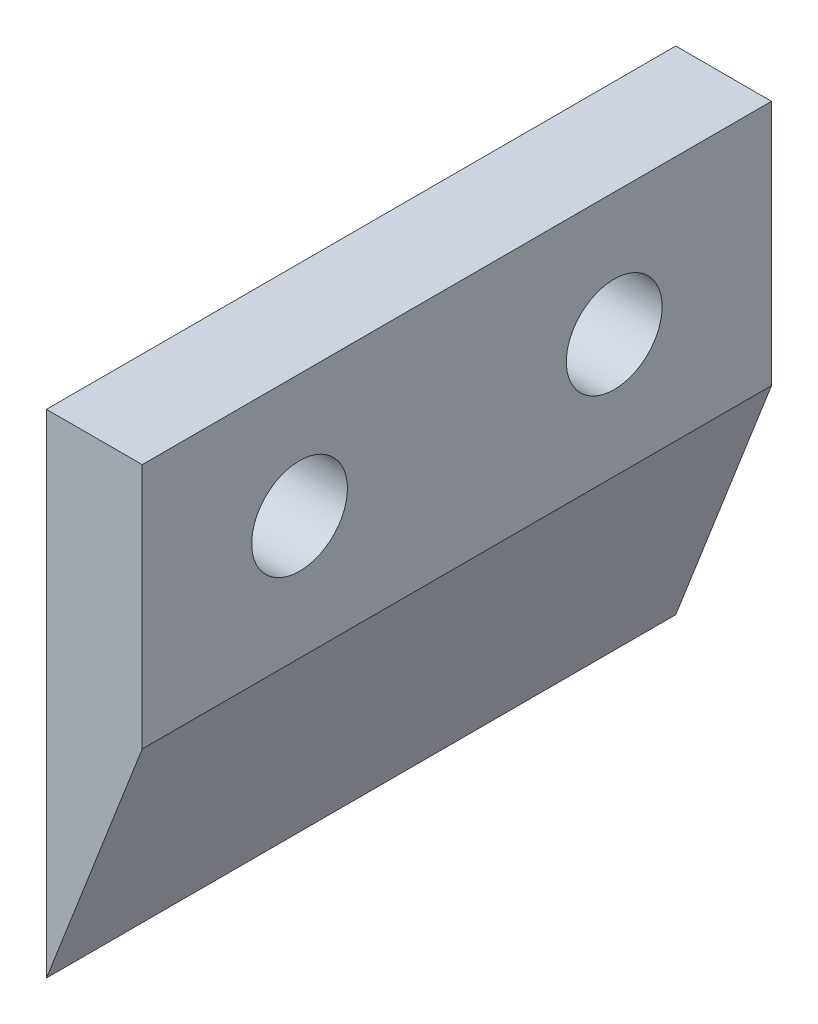
ISO-10303-21;
HEADER;
FILE_DESCRIPTION(('STEP AP214'),'2;1');
FILE_NAME('part.step','',(''),(''),'','','');
FILE_SCHEMA(('AUTOMOTIVE_DESIGN { 1 0 10303 214 1 1 1 1 }'));
ENDSEC;
DATA;
#1=APPLICATION_CONTEXT('core data for automotive mechanical design processes');
#2=APPLICATION_PROTOCOL_DEFINITION('international standard','automotive_design',2000,#1);
#3=PRODUCT_CONTEXT('',#1,'mechanical');
#4=PRODUCT('Part','Part','',(#3));
#5=PRODUCT_RELATED_PRODUCT_CATEGORY('part','',(#4));
#6=PRODUCT_DEFINITION_FORMATION('','',#4);
#7=PRODUCT_DEFINITION_CONTEXT('part definition',#1,'design');
#8=PRODUCT_DEFINITION('design','',#6,#7);
#9=PRODUCT_DEFINITION_SHAPE('','',#8);
#10=(LENGTH_UNIT() NAMED_UNIT(*) SI_UNIT(.MILLI.,.METRE.));
#11=(NAMED_UNIT(*) PLANE_ANGLE_UNIT() SI_UNIT($,.RADIAN.));
#12=(NAMED_UNIT(*) SI_UNIT($,.STERADIAN.) SOLID_ANGLE_UNIT());
#13=UNCERTAINTY_MEASURE_WITH_UNIT(LENGTH_MEASURE(1.E-05),#10,'distance_accuracy_value','');
#14=(GEOMETRIC_REPRESENTATION_CONTEXT(3) GLOBAL_UNCERTAINTY_ASSIGNED_CONTEXT((#13)) GLOBAL_UNIT_ASSIGNED_CONTEXT((#10,
#11,#12)) REPRESENTATION_CONTEXT('',''));
#15=CARTESIAN_POINT('',(0.,0.,0.));
#16=DIRECTION('',(0.,0.,1.));
#17=DIRECTION('',(1.,0.,0.));
#18=AXIS2_PLACEMENT_3D('',#15,#16,#17);
#19=CARTESIAN_POINT('',(3.5,0.,0.));
#20=DIRECTION('',(0.,0.,-1.));
#21=DIRECTION('',(-1.,0.,0.));
#22=AXIS2_PLACEMENT_3D('',#19,#20,#21);
#23=PLANE('',#22);
#24=DIRECTION('',(0.,-1.,0.));
#25=VECTOR('',#24,1.);
#26=CARTESIAN_POINT('',(0.,0.,0.));
#27=LINE('',#26,#25);
#28=CARTESIAN_POINT('',(0.,18.,0.));
#29=VERTEX_POINT('',#28);
#30=CARTESIAN_POINT('',(0.,0.,0.));
#31=VERTEX_POINT('',#30);
#32=EDGE_CURVE('E79',#29,#31,#27,.T.);
#33=ORIENTED_EDGE('',*,*,#32,.T.);
#34=DIRECTION('',(-0.362446261154948,-0.932004671541296,0.));
#35=VECTOR('',#34,1.);
#36=CARTESIAN_POINT('',(3.5,9.,0.));
#37=LINE('',#36,#35);
#38=CARTESIAN_POINT('',(3.5,9.,0.));
#39=VERTEX_POINT('',#38);
#40=EDGE_CURVE('E96',#39,#31,#37,.T.);
#41=ORIENTED_EDGE('',*,*,#40,.F.);
#42=DIRECTION('',(0.,-1.,0.));
#43=VECTOR('',#42,1.);
#44=CARTESIAN_POINT('',(3.5,0.,0.));
#45=LINE('',#44,#43);
#46=CARTESIAN_POINT('',(3.5,18.,0.));
#47=VERTEX_POINT('',#46);
#48=EDGE_CURVE('E74',#47,#39,#45,.T.);
#49=ORIENTED_EDGE('',*,*,#48,.F.);
#50=DIRECTION('',(-1.,0.,0.));
#51=VECTOR('',#50,1.);
#52=CARTESIAN_POINT('',(3.5,18.,0.));
#53=LINE('',#52,#51);
#54=EDGE_CURVE('E42',#47,#29,#53,.T.);
#55=ORIENTED_EDGE('',*,*,#54,.T.);
#56=EDGE_LOOP('',(#33,#41,#49,#55));
#57=FACE_BOUND('',#56,.T.);
#58=ADVANCED_FACE('F34',(#57),#23,.F.);
#59=CARTESIAN_POINT('',(3.5,0.,-23.));
#60=DIRECTION('',(0.,0.,1.));
#61=DIRECTION('',(1.,0.,0.));
#62=AXIS2_PLACEMENT_3D('',#59,#60,#61);
#63=PLANE('',#62);
#64=DIRECTION('',(0.,1.,0.));
#65=VECTOR('',#64,1.);
#66=CARTESIAN_POINT('',(3.5,0.,-23.));
#67=LINE('',#66,#65);
#68=CARTESIAN_POINT('',(3.5,9.,-23.));
#69=VERTEX_POINT('',#68);
#70=CARTESIAN_POINT('',(3.5,18.,-23.));
#71=VERTEX_POINT('',#70);
#72=EDGE_CURVE('E93',#69,#71,#67,.T.);
#73=ORIENTED_EDGE('',*,*,#72,.F.);
#74=DIRECTION('',(-0.362446261154948,-0.932004671541296,0.));
#75=VECTOR('',#74,1.);
#76=CARTESIAN_POINT('',(3.5,9.,-23.));
#77=LINE('',#76,#75);
#78=CARTESIAN_POINT('',(0.,0.,-23.));
#79=VERTEX_POINT('',#78);
#80=EDGE_CURVE('E88',#69,#79,#77,.T.);
#81=ORIENTED_EDGE('',*,*,#80,.T.);
#82=DIRECTION('',(0.,1.,0.));
#83=VECTOR('',#82,1.);
#84=CARTESIAN_POINT('',(0.,0.,-23.));
#85=LINE('',#84,#83);
#86=CARTESIAN_POINT('',(0.,18.,-23.));
#87=VERTEX_POINT('',#86);
#88=EDGE_CURVE('E64',#79,#87,#85,.T.);
#89=ORIENTED_EDGE('',*,*,#88,.T.);
#90=DIRECTION('',(-1.,0.,0.));
#91=VECTOR('',#90,1.);
#92=CARTESIAN_POINT('',(3.5,18.,-23.));
#93=LINE('',#92,#91);
#94=EDGE_CURVE('E11',#71,#87,#93,.T.);
#95=ORIENTED_EDGE('',*,*,#94,.F.);
#96=EDGE_LOOP('',(#73,#81,#89,#95));
#97=FACE_BOUND('',#96,.T.);
#98=ADVANCED_FACE('F135',(#97),#63,.F.);
#99=CARTESIAN_POINT('',(3.5,18.,0.));
#100=DIRECTION('',(0.,-1.,0.));
#101=DIRECTION('',(0.,0.,-1.));
#102=AXIS2_PLACEMENT_3D('',#99,#100,#101);
#103=PLANE('',#102);
#104=DIRECTION('',(0.,0.,1.));
#105=VECTOR('',#104,1.);
#106=CARTESIAN_POINT('',(0.,18.,0.));
#107=LINE('',#106,#105);
#108=EDGE_CURVE('E68',#87,#29,#107,.T.);
#109=ORIENTED_EDGE('',*,*,#108,.T.);
#110=ORIENTED_EDGE('',*,*,#54,.F.);
#111=DIRECTION('',(0.,0.,1.));
#112=VECTOR('',#111,1.);
#113=CARTESIAN_POINT('',(3.5,18.,0.));
#114=LINE('',#113,#112);
#115=EDGE_CURVE('E50',#71,#47,#114,.T.);
#116=ORIENTED_EDGE('',*,*,#115,.F.);
#117=ORIENTED_EDGE('',*,*,#94,.T.);
#118=EDGE_LOOP('',(#109,#110,#116,#117));
#119=FACE_BOUND('',#118,.T.);
#120=ADVANCED_FACE('F70',(#119),#103,.F.);
#121=CARTESIAN_POINT('',(3.5,0.,0.));
#122=DIRECTION('',(-1.,0.,0.));
#123=DIRECTION('',(0.,0.,1.));
#124=AXIS2_PLACEMENT_3D('',#121,#122,#123);
#125=PLANE('',#124);
#126=CARTESIAN_POINT('',(3.5,13.5,-17.25));
#127=DIRECTION('',(1.,0.,0.));
#128=DIRECTION('',(0.,0.,-1.));
#129=AXIS2_PLACEMENT_3D('',#126,#127,#128);
#130=CIRCLE('',#129,1.75);
#131=CARTESIAN_POINT('',(3.5,13.5,-19.));
#132=VERTEX_POINT('',#131);
#133=EDGE_CURVE('E106',#132,#132,#130,.T.);
#134=ORIENTED_EDGE('',*,*,#133,.F.);
#135=EDGE_LOOP('',(#134));
#136=FACE_BOUND('',#135,.T.);
#137=CARTESIAN_POINT('',(3.5,13.5,-5.75));
#138=DIRECTION('',(1.,0.,0.));
#139=DIRECTION('',(0.,0.,-1.));
#140=AXIS2_PLACEMENT_3D('',#137,#138,#139);
#141=CIRCLE('',#140,1.75);
#142=CARTESIAN_POINT('',(3.5,13.5,-7.5));
#143=VERTEX_POINT('',#142);
#144=EDGE_CURVE('E100',#143,#143,#141,.T.);
#145=ORIENTED_EDGE('',*,*,#144,.F.);
#146=EDGE_LOOP('',(#145));
#147=FACE_BOUND('',#146,.T.);
#148=ORIENTED_EDGE('',*,*,#48,.T.);
#149=DIRECTION('',(0.,0.,1.));
#150=VECTOR('',#149,1.);
#151=CARTESIAN_POINT('',(3.5,9.,-23.));
#152=LINE('',#151,#150);
#153=EDGE_CURVE('E84',#69,#39,#152,.T.);
#154=ORIENTED_EDGE('',*,*,#153,.F.);
#155=ORIENTED_EDGE('',*,*,#72,.T.);
#156=ORIENTED_EDGE('',*,*,#115,.T.);
#157=EDGE_LOOP('',(#148,#154,#155,#156));
#158=FACE_BOUND('',#157,.T.);
#159=ADVANCED_FACE('F121',(#136,#147,#158),#125,.F.);
#160=CARTESIAN_POINT('',(0.,0.,0.));
#161=DIRECTION('',(-1.,0.,0.));
#162=DIRECTION('',(0.,0.,1.));
#163=AXIS2_PLACEMENT_3D('',#160,#161,#162);
#164=PLANE('',#163);
#165=CARTESIAN_POINT('',(0.,13.5,-17.25));
#166=DIRECTION('',(1.,0.,0.));
#167=DIRECTION('',(0.,0.,-1.));
#168=AXIS2_PLACEMENT_3D('',#165,#166,#167);
#169=CIRCLE('',#168,1.75);
#170=CARTESIAN_POINT('',(0.,13.5,-19.));
#171=VERTEX_POINT('',#170);
#172=EDGE_CURVE('E103',#171,#171,#169,.T.);
#173=ORIENTED_EDGE('',*,*,#172,.T.);
#174=EDGE_LOOP('',(#173));
#175=FACE_BOUND('',#174,.T.);
#176=CARTESIAN_POINT('',(0.,13.5,-5.75));
#177=DIRECTION('',(1.,0.,0.));
#178=DIRECTION('',(0.,0.,-1.));
#179=AXIS2_PLACEMENT_3D('',#176,#177,#178);
#180=CIRCLE('',#179,1.75);
#181=CARTESIAN_POINT('',(0.,13.5,-7.5));
#182=VERTEX_POINT('',#181);
#183=EDGE_CURVE('E98',#182,#182,#180,.T.);
#184=ORIENTED_EDGE('',*,*,#183,.T.);
#185=EDGE_LOOP('',(#184));
#186=FACE_BOUND('',#185,.T.);
#187=ORIENTED_EDGE('',*,*,#32,.F.);
#188=ORIENTED_EDGE('',*,*,#108,.F.);
#189=ORIENTED_EDGE('',*,*,#88,.F.);
#190=DIRECTION('',(0.,0.,-1.));
#191=VECTOR('',#190,1.);
#192=CARTESIAN_POINT('',(0.,0.,0.));
#193=LINE('',#192,#191);
#194=EDGE_CURVE('E83',#31,#79,#193,.T.);
#195=ORIENTED_EDGE('',*,*,#194,.F.);
#196=EDGE_LOOP('',(#187,#188,#189,#195));
#197=FACE_BOUND('',#196,.T.);
#198=ADVANCED_FACE('F81',(#175,#186,#197),#164,.T.);
#199=CARTESIAN_POINT('',(3.5,9.,-23.));
#200=DIRECTION('',(-0.932004671541296,0.362446261154948,0.));
#201=DIRECTION('',(-0.362446261154948,-0.932004671541296,0.));
#202=AXIS2_PLACEMENT_3D('',#199,#200,#201);
#203=PLANE('',#202);
#204=ORIENTED_EDGE('',*,*,#40,.T.);
#205=ORIENTED_EDGE('',*,*,#194,.T.);
#206=ORIENTED_EDGE('',*,*,#80,.F.);
#207=ORIENTED_EDGE('',*,*,#153,.T.);
#208=EDGE_LOOP('',(#204,#205,#206,#207));
#209=FACE_BOUND('',#208,.T.);
#210=ADVANCED_FACE('F134',(#209),#203,.F.);
#211=CARTESIAN_POINT('',(0.,13.5,-5.75));
#212=DIRECTION('',(1.,0.,0.));
#213=DIRECTION('',(0.,0.,-1.));
#214=AXIS2_PLACEMENT_3D('',#211,#212,#213);
#215=CYLINDRICAL_SURFACE('',#214,1.75);
#216=ORIENTED_EDGE('',*,*,#183,.F.);
#217=EDGE_LOOP('',(#216));
#218=FACE_BOUND('',#217,.T.);
#219=ORIENTED_EDGE('',*,*,#144,.T.);
#220=EDGE_LOOP('',(#219));
#221=FACE_BOUND('',#220,.T.);
#222=ADVANCED_FACE('F117',(#218,#221),#215,.F.);
#223=CARTESIAN_POINT('',(0.,13.5,-17.25));
#224=DIRECTION('',(1.,0.,0.));
#225=DIRECTION('',(0.,0.,-1.));
#226=AXIS2_PLACEMENT_3D('',#223,#224,#225);
#227=CYLINDRICAL_SURFACE('',#226,1.75);
#228=ORIENTED_EDGE('',*,*,#172,.F.);
#229=EDGE_LOOP('',(#228));
#230=FACE_BOUND('',#229,.T.);
#231=ORIENTED_EDGE('',*,*,#133,.T.);
#232=EDGE_LOOP('',(#231));
#233=FACE_BOUND('',#232,.T.);
#234=ADVANCED_FACE('F114',(#230,#233),#227,.F.);
#235=CLOSED_SHELL('',(#58,#98,#120,#159,#198,#210,#222,#234));
#236=MANIFOLD_SOLID_BREP('B2',#235);
#237=ADVANCED_BREP_SHAPE_REPRESENTATION('',(#18,#236),#14);
#238=SHAPE_DEFINITION_REPRESENTATION(#9,#237);
ENDSEC;
END-ISO-10303-21;
